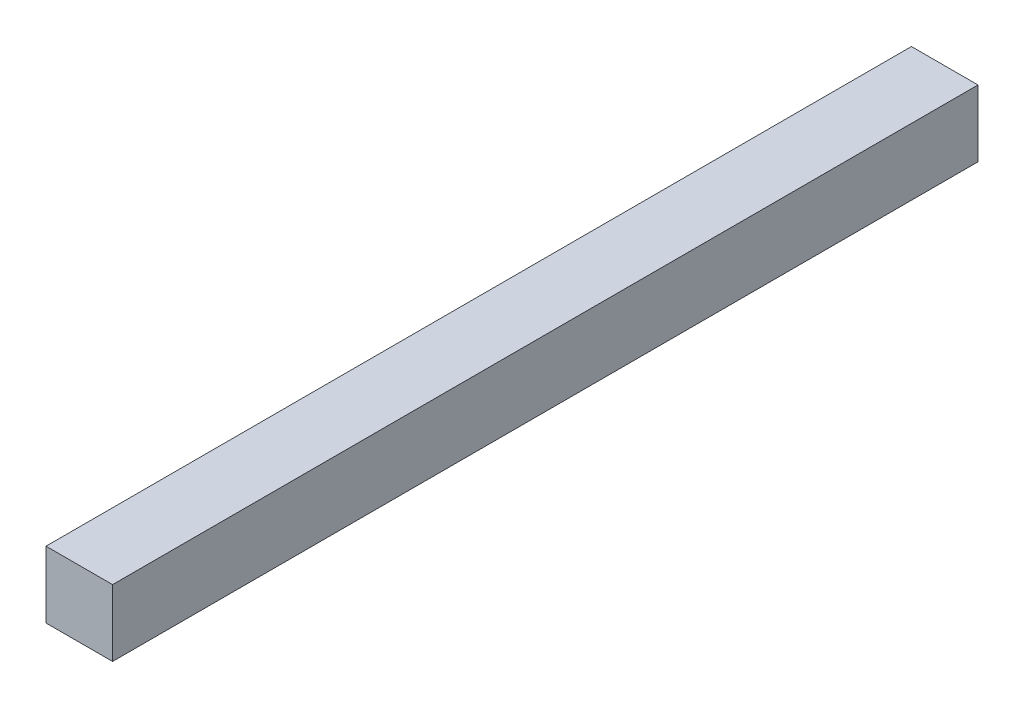
ISO-10303-21;
HEADER;
FILE_DESCRIPTION(('STEP AP214'),'2;1');
FILE_NAME('part.step','',(''),(''),'','','');
FILE_SCHEMA(('AUTOMOTIVE_DESIGN { 1 0 10303 214 1 1 1 1 }'));
ENDSEC;
DATA;
#1=APPLICATION_CONTEXT('core data for automotive mechanical design processes');
#2=APPLICATION_PROTOCOL_DEFINITION('international standard','automotive_design',2000,#1);
#3=PRODUCT_CONTEXT('',#1,'mechanical');
#4=PRODUCT('Part','Part','',(#3));
#5=PRODUCT_RELATED_PRODUCT_CATEGORY('part','',(#4));
#6=PRODUCT_DEFINITION_FORMATION('','',#4);
#7=PRODUCT_DEFINITION_CONTEXT('part definition',#1,'design');
#8=PRODUCT_DEFINITION('design','',#6,#7);
#9=PRODUCT_DEFINITION_SHAPE('','',#8);
#10=(LENGTH_UNIT() NAMED_UNIT(*) SI_UNIT(.MILLI.,.METRE.));
#11=(NAMED_UNIT(*) PLANE_ANGLE_UNIT() SI_UNIT($,.RADIAN.));
#12=(NAMED_UNIT(*) SI_UNIT($,.STERADIAN.) SOLID_ANGLE_UNIT());
#13=UNCERTAINTY_MEASURE_WITH_UNIT(LENGTH_MEASURE(1.E-05),#10,'distance_accuracy_value','');
#14=(GEOMETRIC_REPRESENTATION_CONTEXT(3) GLOBAL_UNCERTAINTY_ASSIGNED_CONTEXT((#13)) GLOBAL_UNIT_ASSIGNED_CONTEXT((#10,
#11,#12)) REPRESENTATION_CONTEXT('',''));
#15=CARTESIAN_POINT('',(0.,0.,0.));
#16=DIRECTION('',(0.,0.,1.));
#17=DIRECTION('',(1.,0.,0.));
#18=AXIS2_PLACEMENT_3D('',#15,#16,#17);
#19=CARTESIAN_POINT('',(0.,0.,82.55));
#20=DIRECTION('',(1.,0.,0.));
#21=DIRECTION('',(0.,0.,-1.));
#22=AXIS2_PLACEMENT_3D('',#19,#20,#21);
#23=PLANE('',#22);
#24=DIRECTION('',(0.,-1.,0.));
#25=VECTOR('',#24,1.);
#26=CARTESIAN_POINT('',(0.,0.,0.));
#27=LINE('',#26,#25);
#28=CARTESIAN_POINT('',(0.,6.35,0.));
#29=VERTEX_POINT('',#28);
#30=CARTESIAN_POINT('',(0.,0.,0.));
#31=VERTEX_POINT('',#30);
#32=EDGE_CURVE('E95',#29,#31,#27,.T.);
#33=ORIENTED_EDGE('',*,*,#32,.T.);
#34=DIRECTION('',(0.,0.,-1.));
#35=VECTOR('',#34,1.);
#36=CARTESIAN_POINT('',(0.,0.,82.55));
#37=LINE('',#36,#35);
#38=CARTESIAN_POINT('',(0.,0.,82.55));
#39=VERTEX_POINT('',#38);
#40=EDGE_CURVE('E11',#39,#31,#37,.T.);
#41=ORIENTED_EDGE('',*,*,#40,.F.);
#42=DIRECTION('',(0.,-1.,0.));
#43=VECTOR('',#42,1.);
#44=CARTESIAN_POINT('',(0.,0.,82.55));
#45=LINE('',#44,#43);
#46=CARTESIAN_POINT('',(0.,6.35,82.55));
#47=VERTEX_POINT('',#46);
#48=EDGE_CURVE('E83',#47,#39,#45,.T.);
#49=ORIENTED_EDGE('',*,*,#48,.F.);
#50=DIRECTION('',(0.,0.,-1.));
#51=VECTOR('',#50,1.);
#52=CARTESIAN_POINT('',(0.,6.35,82.55));
#53=LINE('',#52,#51);
#54=EDGE_CURVE('E91',#47,#29,#53,.T.);
#55=ORIENTED_EDGE('',*,*,#54,.T.);
#56=EDGE_LOOP('',(#33,#41,#49,#55));
#57=FACE_BOUND('',#56,.T.);
#58=ADVANCED_FACE('F32',(#57),#23,.F.);
#59=CARTESIAN_POINT('',(0.,0.,82.55));
#60=DIRECTION('',(0.,1.,0.));
#61=DIRECTION('',(0.,0.,1.));
#62=AXIS2_PLACEMENT_3D('',#59,#60,#61);
#63=PLANE('',#62);
#64=DIRECTION('',(1.,0.,0.));
#65=VECTOR('',#64,1.);
#66=CARTESIAN_POINT('',(0.,0.,0.));
#67=LINE('',#66,#65);
#68=CARTESIAN_POINT('',(6.35,0.,0.));
#69=VERTEX_POINT('',#68);
#70=EDGE_CURVE('E87',#31,#69,#67,.T.);
#71=ORIENTED_EDGE('',*,*,#70,.T.);
#72=DIRECTION('',(0.,0.,-1.));
#73=VECTOR('',#72,1.);
#74=CARTESIAN_POINT('',(6.35,0.,82.55));
#75=LINE('',#74,#73);
#76=CARTESIAN_POINT('',(6.35,0.,82.55));
#77=VERTEX_POINT('',#76);
#78=EDGE_CURVE('E40',#77,#69,#75,.T.);
#79=ORIENTED_EDGE('',*,*,#78,.F.);
#80=DIRECTION('',(1.,0.,0.));
#81=VECTOR('',#80,1.);
#82=CARTESIAN_POINT('',(0.,0.,82.55));
#83=LINE('',#82,#81);
#84=EDGE_CURVE('E78',#39,#77,#83,.T.);
#85=ORIENTED_EDGE('',*,*,#84,.F.);
#86=ORIENTED_EDGE('',*,*,#40,.T.);
#87=EDGE_LOOP('',(#71,#79,#85,#86));
#88=FACE_BOUND('',#87,.T.);
#89=ADVANCED_FACE('F86',(#88),#63,.F.);
#90=CARTESIAN_POINT('',(6.35,0.,82.55));
#91=DIRECTION('',(-1.,0.,0.));
#92=DIRECTION('',(0.,0.,1.));
#93=AXIS2_PLACEMENT_3D('',#90,#91,#92);
#94=PLANE('',#93);
#95=DIRECTION('',(0.,1.,0.));
#96=VECTOR('',#95,1.);
#97=CARTESIAN_POINT('',(6.35,0.,0.));
#98=LINE('',#97,#96);
#99=CARTESIAN_POINT('',(6.35,6.35,0.));
#100=VERTEX_POINT('',#99);
#101=EDGE_CURVE('E65',#69,#100,#98,.T.);
#102=ORIENTED_EDGE('',*,*,#101,.T.);
#103=DIRECTION('',(0.,0.,-1.));
#104=VECTOR('',#103,1.);
#105=CARTESIAN_POINT('',(6.35,6.35,82.55));
#106=LINE('',#105,#104);
#107=CARTESIAN_POINT('',(6.35,6.35,82.55));
#108=VERTEX_POINT('',#107);
#109=EDGE_CURVE('E88',#108,#100,#106,.T.);
#110=ORIENTED_EDGE('',*,*,#109,.F.);
#111=DIRECTION('',(0.,1.,0.));
#112=VECTOR('',#111,1.);
#113=CARTESIAN_POINT('',(6.35,0.,82.55));
#114=LINE('',#113,#112);
#115=EDGE_CURVE('E81',#77,#108,#114,.T.);
#116=ORIENTED_EDGE('',*,*,#115,.F.);
#117=ORIENTED_EDGE('',*,*,#78,.T.);
#118=EDGE_LOOP('',(#102,#110,#116,#117));
#119=FACE_BOUND('',#118,.T.);
#120=ADVANCED_FACE('F89',(#119),#94,.F.);
#121=CARTESIAN_POINT('',(0.,6.35,82.55));
#122=DIRECTION('',(0.,-1.,0.));
#123=DIRECTION('',(0.,0.,-1.));
#124=AXIS2_PLACEMENT_3D('',#121,#122,#123);
#125=PLANE('',#124);
#126=DIRECTION('',(-1.,0.,0.));
#127=VECTOR('',#126,1.);
#128=CARTESIAN_POINT('',(0.,6.35,0.));
#129=LINE('',#128,#127);
#130=EDGE_CURVE('E71',#100,#29,#129,.T.);
#131=ORIENTED_EDGE('',*,*,#130,.T.);
#132=ORIENTED_EDGE('',*,*,#54,.F.);
#133=DIRECTION('',(-1.,0.,0.));
#134=VECTOR('',#133,1.);
#135=CARTESIAN_POINT('',(0.,6.35,82.55));
#136=LINE('',#135,#134);
#137=EDGE_CURVE('E48',#108,#47,#136,.T.);
#138=ORIENTED_EDGE('',*,*,#137,.F.);
#139=ORIENTED_EDGE('',*,*,#109,.T.);
#140=EDGE_LOOP('',(#131,#132,#138,#139));
#141=FACE_BOUND('',#140,.T.);
#142=ADVANCED_FACE('F102',(#141),#125,.F.);
#143=CARTESIAN_POINT('',(0.,0.,82.55));
#144=DIRECTION('',(0.,0.,-1.));
#145=DIRECTION('',(-1.,0.,0.));
#146=AXIS2_PLACEMENT_3D('',#143,#144,#145);
#147=PLANE('',#146);
#148=ORIENTED_EDGE('',*,*,#48,.T.);
#149=ORIENTED_EDGE('',*,*,#84,.T.);
#150=ORIENTED_EDGE('',*,*,#115,.T.);
#151=ORIENTED_EDGE('',*,*,#137,.T.);
#152=EDGE_LOOP('',(#148,#149,#150,#151));
#153=FACE_BOUND('',#152,.T.);
#154=ADVANCED_FACE('F79',(#153),#147,.F.);
#155=CARTESIAN_POINT('',(0.,0.,0.));
#156=DIRECTION('',(0.,0.,-1.));
#157=DIRECTION('',(-1.,0.,0.));
#158=AXIS2_PLACEMENT_3D('',#155,#156,#157);
#159=PLANE('',#158);
#160=ORIENTED_EDGE('',*,*,#32,.F.);
#161=ORIENTED_EDGE('',*,*,#130,.F.);
#162=ORIENTED_EDGE('',*,*,#101,.F.);
#163=ORIENTED_EDGE('',*,*,#70,.F.);
#164=EDGE_LOOP('',(#160,#161,#162,#163));
#165=FACE_BOUND('',#164,.T.);
#166=ADVANCED_FACE('F105',(#165),#159,.T.);
#167=CLOSED_SHELL('',(#58,#89,#120,#142,#154,#166));
#168=MANIFOLD_SOLID_BREP('B2',#167);
#169=ADVANCED_BREP_SHAPE_REPRESENTATION('',(#18,#168),#14);
#170=SHAPE_DEFINITION_REPRESENTATION(#9,#169);
ENDSEC;
END-ISO-10303-21;
